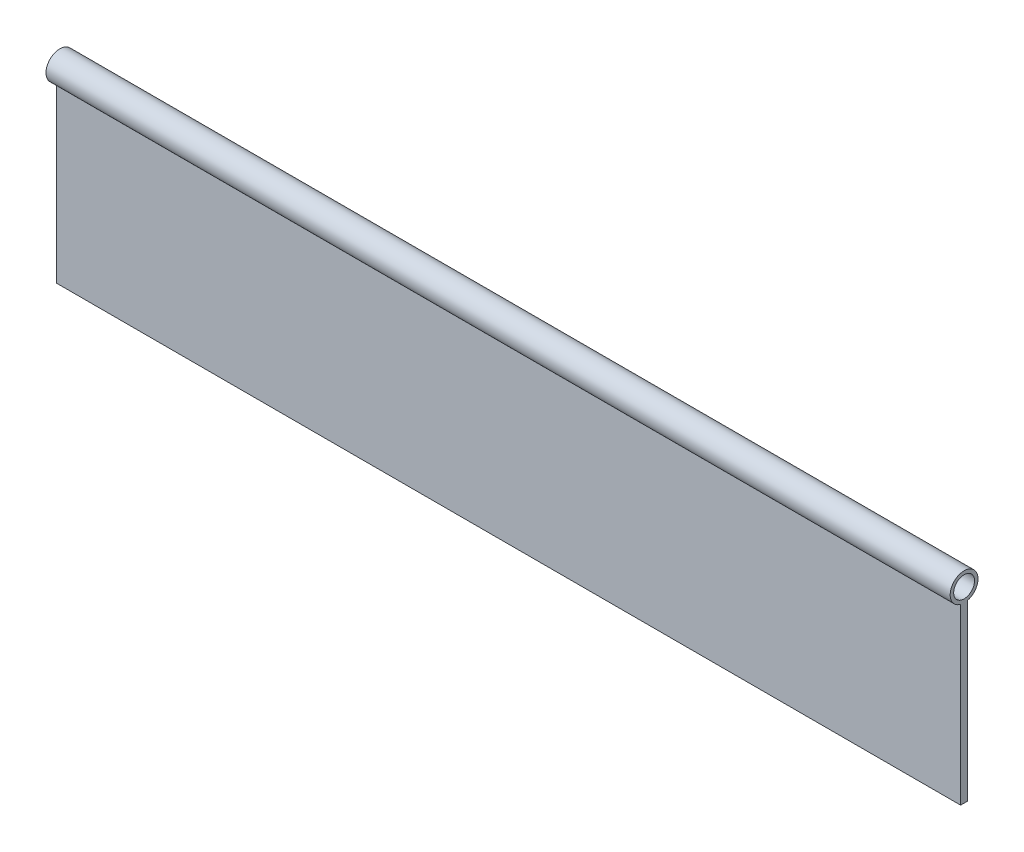
ISO-10303-21;
HEADER;
FILE_DESCRIPTION(('STEP AP214'),'2;1');
FILE_NAME('part.step','',(''),(''),'','','');
FILE_SCHEMA(('AUTOMOTIVE_DESIGN { 1 0 10303 214 1 1 1 1 }'));
ENDSEC;
DATA;
#1=APPLICATION_CONTEXT('core data for automotive mechanical design processes');
#2=APPLICATION_PROTOCOL_DEFINITION('international standard','automotive_design',2000,#1);
#3=PRODUCT_CONTEXT('',#1,'mechanical');
#4=PRODUCT('Part','Part','',(#3));
#5=PRODUCT_RELATED_PRODUCT_CATEGORY('part','',(#4));
#6=PRODUCT_DEFINITION_FORMATION('','',#4);
#7=PRODUCT_DEFINITION_CONTEXT('part definition',#1,'design');
#8=PRODUCT_DEFINITION('design','',#6,#7);
#9=PRODUCT_DEFINITION_SHAPE('','',#8);
#10=(LENGTH_UNIT() NAMED_UNIT(*) SI_UNIT(.MILLI.,.METRE.));
#11=(NAMED_UNIT(*) PLANE_ANGLE_UNIT() SI_UNIT($,.RADIAN.));
#12=(NAMED_UNIT(*) SI_UNIT($,.STERADIAN.) SOLID_ANGLE_UNIT());
#13=UNCERTAINTY_MEASURE_WITH_UNIT(LENGTH_MEASURE(1.E-05),#10,'distance_accuracy_value','');
#14=(GEOMETRIC_REPRESENTATION_CONTEXT(3) GLOBAL_UNCERTAINTY_ASSIGNED_CONTEXT((#13)) GLOBAL_UNIT_ASSIGNED_CONTEXT((#10,
#11,#12)) REPRESENTATION_CONTEXT('',''));
#15=CARTESIAN_POINT('',(0.,0.,0.));
#16=DIRECTION('',(0.,0.,1.));
#17=DIRECTION('',(1.,0.,0.));
#18=AXIS2_PLACEMENT_3D('',#15,#16,#17);
#19=CARTESIAN_POINT('',(260.,0.,0.));
#20=DIRECTION('',(1.,0.,0.));
#21=DIRECTION('',(0.,0.,-1.));
#22=AXIS2_PLACEMENT_3D('',#19,#20,#21);
#23=PLANE('',#22);
#24=CARTESIAN_POINT('',(260.,0.,0.));
#25=DIRECTION('',(1.,0.,0.));
#26=DIRECTION('',(0.,0.,-1.));
#27=AXIS2_PLACEMENT_3D('',#24,#25,#26);
#28=CIRCLE('',#27,4.);
#29=CARTESIAN_POINT('',(260.,-3.87298334620742,-1.));
#30=VERTEX_POINT('',#29);
#31=CARTESIAN_POINT('',(260.,-3.87298334620742,1.));
#32=VERTEX_POINT('',#31);
#33=EDGE_CURVE('E85',#30,#32,#28,.T.);
#34=ORIENTED_EDGE('',*,*,#33,.T.);
#35=DIRECTION('',(0.,-1.,0.));
#36=VECTOR('',#35,1.);
#37=CARTESIAN_POINT('',(260.,-3.87298334620742,1.));
#38=LINE('',#37,#36);
#39=CARTESIAN_POINT('',(260.,-53.8729833462074,0.999999999999994));
#40=VERTEX_POINT('',#39);
#41=EDGE_CURVE('E80',#32,#40,#38,.T.);
#42=ORIENTED_EDGE('',*,*,#41,.T.);
#43=DIRECTION('',(0.,0.,-1.));
#44=VECTOR('',#43,1.);
#45=CARTESIAN_POINT('',(260.,-53.8729833462074,0.999999999999994));
#46=LINE('',#45,#44);
#47=CARTESIAN_POINT('',(260.,-53.8729833462074,-1.00000000000001));
#48=VERTEX_POINT('',#47);
#49=EDGE_CURVE('E83',#40,#48,#46,.T.);
#50=ORIENTED_EDGE('',*,*,#49,.T.);
#51=DIRECTION('',(0.,1.,0.));
#52=VECTOR('',#51,1.);
#53=CARTESIAN_POINT('',(260.,-3.87298334620742,-1.));
#54=LINE('',#53,#52);
#55=EDGE_CURVE('E50',#48,#30,#54,.T.);
#56=ORIENTED_EDGE('',*,*,#55,.T.);
#57=EDGE_LOOP('',(#34,#42,#50,#56));
#58=FACE_BOUND('',#57,.T.);
#59=CARTESIAN_POINT('',(260.,0.,0.));
#60=DIRECTION('',(1.,0.,0.));
#61=DIRECTION('',(0.,0.,-1.));
#62=AXIS2_PLACEMENT_3D('',#59,#60,#61);
#63=CIRCLE('',#62,3.);
#64=CARTESIAN_POINT('',(260.,0.,-3.));
#65=VERTEX_POINT('',#64);
#66=EDGE_CURVE('E100',#65,#65,#63,.T.);
#67=ORIENTED_EDGE('',*,*,#66,.F.);
#68=EDGE_LOOP('',(#67));
#69=FACE_BOUND('',#68,.T.);
#70=ADVANCED_FACE('F33',(#58,#69),#23,.T.);
#71=CARTESIAN_POINT('',(0.,0.,0.));
#72=DIRECTION('',(1.,0.,0.));
#73=DIRECTION('',(0.,0.,-1.));
#74=AXIS2_PLACEMENT_3D('',#71,#72,#73);
#75=PLANE('',#74);
#76=CARTESIAN_POINT('',(0.,0.,0.));
#77=DIRECTION('',(1.,0.,0.));
#78=DIRECTION('',(0.,0.,-1.));
#79=AXIS2_PLACEMENT_3D('',#76,#77,#78);
#80=CIRCLE('',#79,4.);
#81=CARTESIAN_POINT('',(0.,-3.87298334620742,-1.));
#82=VERTEX_POINT('',#81);
#83=CARTESIAN_POINT('',(0.,-3.87298334620742,1.));
#84=VERTEX_POINT('',#83);
#85=EDGE_CURVE('E97',#82,#84,#80,.T.);
#86=ORIENTED_EDGE('',*,*,#85,.F.);
#87=DIRECTION('',(0.,1.,0.));
#88=VECTOR('',#87,1.);
#89=CARTESIAN_POINT('',(0.,-3.87298334620742,-1.));
#90=LINE('',#89,#88);
#91=CARTESIAN_POINT('',(0.,-53.8729833462074,-1.00000000000001));
#92=VERTEX_POINT('',#91);
#93=EDGE_CURVE('E73',#92,#82,#90,.T.);
#94=ORIENTED_EDGE('',*,*,#93,.F.);
#95=DIRECTION('',(0.,0.,-1.));
#96=VECTOR('',#95,1.);
#97=CARTESIAN_POINT('',(0.,-53.8729833462074,0.999999999999994));
#98=LINE('',#97,#96);
#99=CARTESIAN_POINT('',(0.,-53.8729833462074,0.999999999999994));
#100=VERTEX_POINT('',#99);
#101=EDGE_CURVE('E67',#100,#92,#98,.T.);
#102=ORIENTED_EDGE('',*,*,#101,.F.);
#103=DIRECTION('',(0.,-1.,0.));
#104=VECTOR('',#103,1.);
#105=CARTESIAN_POINT('',(0.,-3.87298334620742,1.));
#106=LINE('',#105,#104);
#107=EDGE_CURVE('E89',#84,#100,#106,.T.);
#108=ORIENTED_EDGE('',*,*,#107,.F.);
#109=EDGE_LOOP('',(#86,#94,#102,#108));
#110=FACE_BOUND('',#109,.T.);
#111=CARTESIAN_POINT('',(0.,0.,0.));
#112=DIRECTION('',(1.,0.,0.));
#113=DIRECTION('',(0.,0.,-1.));
#114=AXIS2_PLACEMENT_3D('',#111,#112,#113);
#115=CIRCLE('',#114,3.);
#116=CARTESIAN_POINT('',(0.,0.,-3.));
#117=VERTEX_POINT('',#116);
#118=EDGE_CURVE('E112',#117,#117,#115,.T.);
#119=ORIENTED_EDGE('',*,*,#118,.T.);
#120=EDGE_LOOP('',(#119));
#121=FACE_BOUND('',#120,.T.);
#122=ADVANCED_FACE('F108',(#110,#121),#75,.F.);
#123=CARTESIAN_POINT('',(260.,0.,0.));
#124=DIRECTION('',(-1.,0.,0.));
#125=DIRECTION('',(0.,0.,1.));
#126=AXIS2_PLACEMENT_3D('',#123,#124,#125);
#127=CYLINDRICAL_SURFACE('',#126,4.);
#128=ORIENTED_EDGE('',*,*,#85,.T.);
#129=DIRECTION('',(-1.,0.,0.));
#130=VECTOR('',#129,1.);
#131=CARTESIAN_POINT('',(260.,-3.87298334620742,1.));
#132=LINE('',#131,#130);
#133=EDGE_CURVE('E11',#32,#84,#132,.T.);
#134=ORIENTED_EDGE('',*,*,#133,.F.);
#135=ORIENTED_EDGE('',*,*,#33,.F.);
#136=DIRECTION('',(-1.,0.,0.));
#137=VECTOR('',#136,1.);
#138=CARTESIAN_POINT('',(260.,-3.87298334620742,-1.));
#139=LINE('',#138,#137);
#140=EDGE_CURVE('E93',#30,#82,#139,.T.);
#141=ORIENTED_EDGE('',*,*,#140,.T.);
#142=EDGE_LOOP('',(#128,#134,#135,#141));
#143=FACE_BOUND('',#142,.T.);
#144=ADVANCED_FACE('F35',(#143),#127,.T.);
#145=CARTESIAN_POINT('',(260.,-3.87298334620742,1.));
#146=DIRECTION('',(0.,0.,-1.));
#147=DIRECTION('',(0.,1.,0.));
#148=AXIS2_PLACEMENT_3D('',#145,#146,#147);
#149=PLANE('',#148);
#150=ORIENTED_EDGE('',*,*,#107,.T.);
#151=DIRECTION('',(-1.,0.,0.));
#152=VECTOR('',#151,1.);
#153=CARTESIAN_POINT('',(260.,-53.8729833462074,0.999999999999994));
#154=LINE('',#153,#152);
#155=EDGE_CURVE('E42',#40,#100,#154,.T.);
#156=ORIENTED_EDGE('',*,*,#155,.F.);
#157=ORIENTED_EDGE('',*,*,#41,.F.);
#158=ORIENTED_EDGE('',*,*,#133,.T.);
#159=EDGE_LOOP('',(#150,#156,#157,#158));
#160=FACE_BOUND('',#159,.T.);
#161=ADVANCED_FACE('F88',(#160),#149,.F.);
#162=CARTESIAN_POINT('',(260.,-53.8729833462074,0.999999999999994));
#163=DIRECTION('',(0.,1.,0.));
#164=DIRECTION('',(0.,0.,1.));
#165=AXIS2_PLACEMENT_3D('',#162,#163,#164);
#166=PLANE('',#165);
#167=ORIENTED_EDGE('',*,*,#101,.T.);
#168=DIRECTION('',(-1.,0.,0.));
#169=VECTOR('',#168,1.);
#170=CARTESIAN_POINT('',(260.,-53.8729833462074,-1.00000000000001));
#171=LINE('',#170,#169);
#172=EDGE_CURVE('E90',#48,#92,#171,.T.);
#173=ORIENTED_EDGE('',*,*,#172,.F.);
#174=ORIENTED_EDGE('',*,*,#49,.F.);
#175=ORIENTED_EDGE('',*,*,#155,.T.);
#176=EDGE_LOOP('',(#167,#173,#174,#175));
#177=FACE_BOUND('',#176,.T.);
#178=ADVANCED_FACE('F91',(#177),#166,.F.);
#179=CARTESIAN_POINT('',(260.,-3.87298334620742,-1.));
#180=DIRECTION('',(0.,0.,1.));
#181=DIRECTION('',(0.,-1.,0.));
#182=AXIS2_PLACEMENT_3D('',#179,#180,#181);
#183=PLANE('',#182);
#184=ORIENTED_EDGE('',*,*,#93,.T.);
#185=ORIENTED_EDGE('',*,*,#140,.F.);
#186=ORIENTED_EDGE('',*,*,#55,.F.);
#187=ORIENTED_EDGE('',*,*,#172,.T.);
#188=EDGE_LOOP('',(#184,#185,#186,#187));
#189=FACE_BOUND('',#188,.T.);
#190=ADVANCED_FACE('F105',(#189),#183,.F.);
#191=CARTESIAN_POINT('',(260.,0.,0.));
#192=DIRECTION('',(-1.,0.,0.));
#193=DIRECTION('',(0.,0.,1.));
#194=AXIS2_PLACEMENT_3D('',#191,#192,#193);
#195=CYLINDRICAL_SURFACE('',#194,3.);
#196=ORIENTED_EDGE('',*,*,#66,.T.);
#197=EDGE_LOOP('',(#196));
#198=FACE_BOUND('',#197,.T.);
#199=ORIENTED_EDGE('',*,*,#118,.F.);
#200=EDGE_LOOP('',(#199));
#201=FACE_BOUND('',#200,.T.);
#202=ADVANCED_FACE('F118',(#198,#201),#195,.F.);
#203=CLOSED_SHELL('',(#70,#122,#144,#161,#178,#190,#202));
#204=MANIFOLD_SOLID_BREP('B2',#203);
#205=ADVANCED_BREP_SHAPE_REPRESENTATION('',(#18,#204),#14);
#206=SHAPE_DEFINITION_REPRESENTATION(#9,#205);
ENDSEC;
END-ISO-10303-21;
